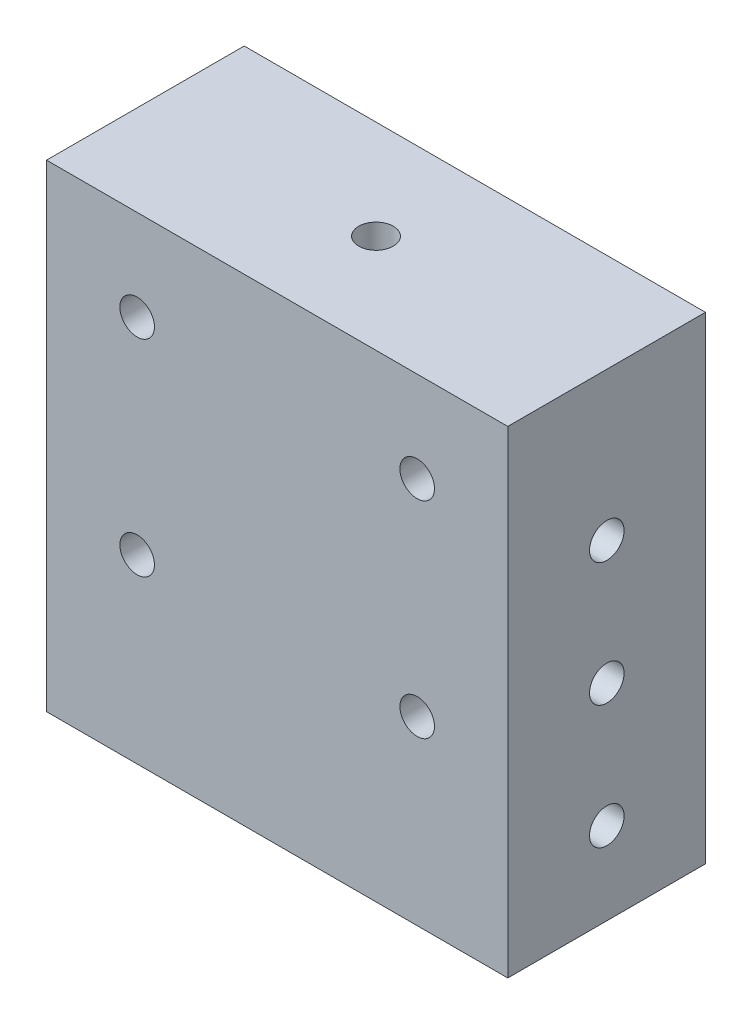
ISO-10303-21;
HEADER;
FILE_DESCRIPTION(('STEP AP214'),'2;1');
FILE_NAME('part.step','',(''),(''),'','','');
FILE_SCHEMA(('AUTOMOTIVE_DESIGN { 1 0 10303 214 1 1 1 1 }'));
ENDSEC;
DATA;
#1=APPLICATION_CONTEXT('core data for automotive mechanical design processes');
#2=APPLICATION_PROTOCOL_DEFINITION('international standard','automotive_design',2000,#1);
#3=PRODUCT_CONTEXT('',#1,'mechanical');
#4=PRODUCT('Part','Part','',(#3));
#5=PRODUCT_RELATED_PRODUCT_CATEGORY('part','',(#4));
#6=PRODUCT_DEFINITION_FORMATION('','',#4);
#7=PRODUCT_DEFINITION_CONTEXT('part definition',#1,'design');
#8=PRODUCT_DEFINITION('design','',#6,#7);
#9=PRODUCT_DEFINITION_SHAPE('','',#8);
#10=(LENGTH_UNIT() NAMED_UNIT(*) SI_UNIT(.MILLI.,.METRE.));
#11=(NAMED_UNIT(*) PLANE_ANGLE_UNIT() SI_UNIT($,.RADIAN.));
#12=(NAMED_UNIT(*) SI_UNIT($,.STERADIAN.) SOLID_ANGLE_UNIT());
#13=UNCERTAINTY_MEASURE_WITH_UNIT(LENGTH_MEASURE(1.E-05),#10,'distance_accuracy_value','');
#14=(GEOMETRIC_REPRESENTATION_CONTEXT(3) GLOBAL_UNCERTAINTY_ASSIGNED_CONTEXT((#13)) GLOBAL_UNIT_ASSIGNED_CONTEXT((#10,
#11,#12)) REPRESENTATION_CONTEXT('',''));
#15=CARTESIAN_POINT('',(0.,0.,0.));
#16=DIRECTION('',(0.,0.,1.));
#17=DIRECTION('',(1.,0.,0.));
#18=AXIS2_PLACEMENT_3D('',#15,#16,#17);
#19=CARTESIAN_POINT('',(0.,0.,4.));
#20=DIRECTION('',(0.,0.,1.));
#21=DIRECTION('',(1.,0.,0.));
#22=AXIS2_PLACEMENT_3D('',#19,#20,#21);
#23=PLANE('',#22);
#24=CARTESIAN_POINT('',(17.,22.,4.));
#25=DIRECTION('',(0.,0.,-1.));
#26=DIRECTION('',(-1.,0.,0.));
#27=AXIS2_PLACEMENT_3D('',#24,#25,#26);
#28=CIRCLE('',#27,2.1);
#29=CARTESIAN_POINT('',(14.9,22.,4.));
#30=VERTEX_POINT('',#29);
#31=EDGE_CURVE('E376',#30,#30,#28,.T.);
#32=ORIENTED_EDGE('',*,*,#31,.T.);
#33=EDGE_LOOP('',(#32));
#34=FACE_BOUND('',#33,.T.);
#35=DIRECTION('',(-1.,0.,0.));
#36=VECTOR('',#35,1.);
#37=CARTESIAN_POINT('',(28.,33.,4.));
#38=LINE('',#37,#36);
#39=CARTESIAN_POINT('',(28.,33.,4.));
#40=VERTEX_POINT('',#39);
#41=CARTESIAN_POINT('',(-28.,33.,4.));
#42=VERTEX_POINT('',#41);
#43=EDGE_CURVE('E180',#40,#42,#38,.T.);
#44=ORIENTED_EDGE('',*,*,#43,.T.);
#45=DIRECTION('',(0.,1.,0.));
#46=VECTOR('',#45,1.);
#47=CARTESIAN_POINT('',(-28.,-25.,4.));
#48=LINE('',#47,#46);
#49=CARTESIAN_POINT('',(-28.,-25.,4.));
#50=VERTEX_POINT('',#49);
#51=EDGE_CURVE('E231',#50,#42,#48,.T.);
#52=ORIENTED_EDGE('',*,*,#51,.F.);
#53=DIRECTION('',(1.,0.,0.));
#54=VECTOR('',#53,1.);
#55=CARTESIAN_POINT('',(20.,-25.,4.));
#56=LINE('',#55,#54);
#57=CARTESIAN_POINT('',(28.,-25.,4.));
#58=VERTEX_POINT('',#57);
#59=EDGE_CURVE('E184',#50,#58,#56,.T.);
#60=ORIENTED_EDGE('',*,*,#59,.T.);
#61=DIRECTION('',(0.,-1.,0.));
#62=VECTOR('',#61,1.);
#63=CARTESIAN_POINT('',(28.,-25.,4.));
#64=LINE('',#63,#62);
#65=EDGE_CURVE('E257',#40,#58,#64,.T.);
#66=ORIENTED_EDGE('',*,*,#65,.F.);
#67=EDGE_LOOP('',(#44,#52,#60,#66));
#68=FACE_BOUND('',#67,.T.);
#69=CARTESIAN_POINT('',(17.,-3.,4.));
#70=DIRECTION('',(0.,0.,-1.));
#71=DIRECTION('',(-1.,0.,0.));
#72=AXIS2_PLACEMENT_3D('',#69,#70,#71);
#73=CIRCLE('',#72,2.1);
#74=CARTESIAN_POINT('',(14.9,-3.,4.));
#75=VERTEX_POINT('',#74);
#76=EDGE_CURVE('E166',#75,#75,#73,.T.);
#77=ORIENTED_EDGE('',*,*,#76,.T.);
#78=EDGE_LOOP('',(#77));
#79=FACE_BOUND('',#78,.T.);
#80=CARTESIAN_POINT('',(-17.,-3.,4.));
#81=DIRECTION('',(0.,0.,-1.));
#82=DIRECTION('',(-1.,0.,0.));
#83=AXIS2_PLACEMENT_3D('',#80,#81,#82);
#84=CIRCLE('',#83,2.1);
#85=CARTESIAN_POINT('',(-19.1,-3.,4.));
#86=VERTEX_POINT('',#85);
#87=EDGE_CURVE('E404',#86,#86,#84,.T.);
#88=ORIENTED_EDGE('',*,*,#87,.T.);
#89=EDGE_LOOP('',(#88));
#90=FACE_BOUND('',#89,.T.);
#91=CARTESIAN_POINT('',(-17.,22.,4.));
#92=DIRECTION('',(0.,0.,-1.));
#93=DIRECTION('',(-1.,0.,0.));
#94=AXIS2_PLACEMENT_3D('',#91,#92,#93);
#95=CIRCLE('',#94,2.1);
#96=CARTESIAN_POINT('',(-19.1,22.,4.));
#97=VERTEX_POINT('',#96);
#98=EDGE_CURVE('E396',#97,#97,#95,.T.);
#99=ORIENTED_EDGE('',*,*,#98,.T.);
#100=EDGE_LOOP('',(#99));
#101=FACE_BOUND('',#100,.T.);
#102=ADVANCED_FACE('F56',(#34,#68,#79,#90,#101),#23,.T.);
#103=CARTESIAN_POINT('',(0.,0.,-4.));
#104=DIRECTION('',(0.,0.,1.));
#105=DIRECTION('',(1.,0.,0.));
#106=AXIS2_PLACEMENT_3D('',#103,#104,#105);
#107=PLANE('',#106);
#108=CARTESIAN_POINT('',(17.,22.,-4.));
#109=DIRECTION('',(0.,0.,-1.));
#110=DIRECTION('',(-1.,0.,0.));
#111=AXIS2_PLACEMENT_3D('',#108,#109,#110);
#112=CIRCLE('',#111,2.1);
#113=CARTESIAN_POINT('',(14.9,22.,-4.));
#114=VERTEX_POINT('',#113);
#115=EDGE_CURVE('E370',#114,#114,#112,.T.);
#116=ORIENTED_EDGE('',*,*,#115,.F.);
#117=EDGE_LOOP('',(#116));
#118=FACE_BOUND('',#117,.T.);
#119=CARTESIAN_POINT('',(-17.,22.,-4.));
#120=DIRECTION('',(0.,0.,-1.));
#121=DIRECTION('',(-1.,0.,0.));
#122=AXIS2_PLACEMENT_3D('',#119,#120,#121);
#123=CIRCLE('',#122,2.1);
#124=CARTESIAN_POINT('',(-19.1,22.,-4.));
#125=VERTEX_POINT('',#124);
#126=EDGE_CURVE('E392',#125,#125,#123,.T.);
#127=ORIENTED_EDGE('',*,*,#126,.F.);
#128=EDGE_LOOP('',(#127));
#129=FACE_BOUND('',#128,.T.);
#130=CARTESIAN_POINT('',(-17.,-3.,-4.));
#131=DIRECTION('',(0.,0.,-1.));
#132=DIRECTION('',(-1.,0.,0.));
#133=AXIS2_PLACEMENT_3D('',#130,#131,#132);
#134=CIRCLE('',#133,2.1);
#135=CARTESIAN_POINT('',(-19.1,-3.,-4.));
#136=VERTEX_POINT('',#135);
#137=EDGE_CURVE('E400',#136,#136,#134,.T.);
#138=ORIENTED_EDGE('',*,*,#137,.F.);
#139=EDGE_LOOP('',(#138));
#140=FACE_BOUND('',#139,.T.);
#141=DIRECTION('',(0.,-1.,0.));
#142=VECTOR('',#141,1.);
#143=CARTESIAN_POINT('',(-20.,-25.,-4.));
#144=LINE('',#143,#142);
#145=CARTESIAN_POINT('',(-20.,25.,-4.));
#146=VERTEX_POINT('',#145);
#147=CARTESIAN_POINT('',(-20.,-25.,-4.));
#148=VERTEX_POINT('',#147);
#149=EDGE_CURVE('E179',#146,#148,#144,.T.);
#150=ORIENTED_EDGE('',*,*,#149,.F.);
#151=DIRECTION('',(-1.,0.,0.));
#152=VECTOR('',#151,1.);
#153=CARTESIAN_POINT('',(20.,25.,-4.));
#154=LINE('',#153,#152);
#155=CARTESIAN_POINT('',(20.,25.,-4.));
#156=VERTEX_POINT('',#155);
#157=EDGE_CURVE('E187',#156,#146,#154,.T.);
#158=ORIENTED_EDGE('',*,*,#157,.F.);
#159=DIRECTION('',(0.,1.,0.));
#160=VECTOR('',#159,1.);
#161=CARTESIAN_POINT('',(20.,-25.,-4.));
#162=LINE('',#161,#160);
#163=CARTESIAN_POINT('',(20.,-25.,-4.));
#164=VERTEX_POINT('',#163);
#165=EDGE_CURVE('E194',#164,#156,#162,.T.);
#166=ORIENTED_EDGE('',*,*,#165,.F.);
#167=DIRECTION('',(1.,0.,0.));
#168=VECTOR('',#167,1.);
#169=CARTESIAN_POINT('',(20.,-25.,-4.));
#170=LINE('',#169,#168);
#171=EDGE_CURVE('E191',#148,#164,#170,.T.);
#172=ORIENTED_EDGE('',*,*,#171,.F.);
#173=EDGE_LOOP('',(#150,#158,#166,#172));
#174=FACE_BOUND('',#173,.T.);
#175=CARTESIAN_POINT('',(17.,-3.,-4.));
#176=DIRECTION('',(0.,0.,-1.));
#177=DIRECTION('',(-1.,0.,0.));
#178=AXIS2_PLACEMENT_3D('',#175,#176,#177);
#179=CIRCLE('',#178,2.1);
#180=CARTESIAN_POINT('',(14.9,-3.,-4.));
#181=VERTEX_POINT('',#180);
#182=EDGE_CURVE('E408',#181,#181,#179,.T.);
#183=ORIENTED_EDGE('',*,*,#182,.F.);
#184=EDGE_LOOP('',(#183));
#185=FACE_BOUND('',#184,.T.);
#186=ADVANCED_FACE('F308',(#118,#129,#140,#174,#185),#107,.F.);
#187=CARTESIAN_POINT('',(-82.7694193059008,0.,-12.05));
#188=DIRECTION('',(0.,0.,-1.));
#189=DIRECTION('',(0.,1.,0.));
#190=AXIS2_PLACEMENT_3D('',#187,#188,#189);
#191=PLANE('',#190);
#192=DIRECTION('',(1.,0.,0.));
#193=VECTOR('',#192,1.);
#194=CARTESIAN_POINT('',(-82.7694193059008,25.,-12.05));
#195=LINE('',#194,#193);
#196=CARTESIAN_POINT('',(16.,25.,-12.05));
#197=VERTEX_POINT('',#196);
#198=CARTESIAN_POINT('',(20.,25.,-12.05));
#199=VERTEX_POINT('',#198);
#200=EDGE_CURVE('E217',#197,#199,#195,.T.);
#201=ORIENTED_EDGE('',*,*,#200,.F.);
#202=DIRECTION('',(0.,-1.,0.));
#203=VECTOR('',#202,1.);
#204=CARTESIAN_POINT('',(16.,0.,-12.05));
#205=LINE('',#204,#203);
#206=CARTESIAN_POINT('',(16.,-25.,-12.05));
#207=VERTEX_POINT('',#206);
#208=EDGE_CURVE('E13',#197,#207,#205,.T.);
#209=ORIENTED_EDGE('',*,*,#208,.T.);
#210=DIRECTION('',(1.,0.,0.));
#211=VECTOR('',#210,1.);
#212=CARTESIAN_POINT('',(-82.7694193059008,-25.,-12.05));
#213=LINE('',#212,#211);
#214=CARTESIAN_POINT('',(20.,-25.,-12.05));
#215=VERTEX_POINT('',#214);
#216=EDGE_CURVE('E230',#207,#215,#213,.T.);
#217=ORIENTED_EDGE('',*,*,#216,.T.);
#218=DIRECTION('',(0.,1.,0.));
#219=VECTOR('',#218,1.);
#220=CARTESIAN_POINT('',(20.,0.,-12.05));
#221=LINE('',#220,#219);
#222=EDGE_CURVE('E224',#215,#199,#221,.T.);
#223=ORIENTED_EDGE('',*,*,#222,.T.);
#224=EDGE_LOOP('',(#201,#209,#217,#223));
#225=FACE_BOUND('',#224,.T.);
#226=ADVANCED_FACE('F317',(#225),#191,.F.);
#227=CARTESIAN_POINT('',(20.,0.,0.));
#228=DIRECTION('',(-1.,0.,0.));
#229=DIRECTION('',(0.,0.,1.));
#230=AXIS2_PLACEMENT_3D('',#227,#228,#229);
#231=PLANE('',#230);
#232=CARTESIAN_POINT('',(20.,15.,-8.025));
#233=DIRECTION('',(-1.,0.,0.));
#234=DIRECTION('',(0.,0.,1.));
#235=AXIS2_PLACEMENT_3D('',#232,#233,#234);
#236=CIRCLE('',#235,2.09999999999999);
#237=CARTESIAN_POINT('',(20.,15.,-5.92500000000001));
#238=VERTEX_POINT('',#237);
#239=EDGE_CURVE('E458',#238,#238,#236,.T.);
#240=ORIENTED_EDGE('',*,*,#239,.F.);
#241=EDGE_LOOP('',(#240));
#242=FACE_BOUND('',#241,.T.);
#243=CARTESIAN_POINT('',(20.,0.,-8.02500000000001));
#244=DIRECTION('',(-1.,0.,0.));
#245=DIRECTION('',(0.,0.,1.));
#246=AXIS2_PLACEMENT_3D('',#243,#244,#245);
#247=CIRCLE('',#246,2.09999999999999);
#248=CARTESIAN_POINT('',(20.,0.,-5.92500000000001));
#249=VERTEX_POINT('',#248);
#250=EDGE_CURVE('E466',#249,#249,#247,.T.);
#251=ORIENTED_EDGE('',*,*,#250,.F.);
#252=EDGE_LOOP('',(#251));
#253=FACE_BOUND('',#252,.T.);
#254=CARTESIAN_POINT('',(20.,-15.,-8.025));
#255=DIRECTION('',(-1.,0.,0.));
#256=DIRECTION('',(0.,0.,1.));
#257=AXIS2_PLACEMENT_3D('',#254,#255,#256);
#258=CIRCLE('',#257,2.09999999999999);
#259=CARTESIAN_POINT('',(20.,-15.,-5.92500000000001));
#260=VERTEX_POINT('',#259);
#261=EDGE_CURVE('E379',#260,#260,#258,.T.);
#262=ORIENTED_EDGE('',*,*,#261,.F.);
#263=EDGE_LOOP('',(#262));
#264=FACE_BOUND('',#263,.T.);
#265=DIRECTION('',(0.,0.,1.));
#266=VECTOR('',#265,1.);
#267=CARTESIAN_POINT('',(20.,25.,0.));
#268=LINE('',#267,#266);
#269=EDGE_CURVE('E216',#199,#156,#268,.T.);
#270=ORIENTED_EDGE('',*,*,#269,.F.);
#271=ORIENTED_EDGE('',*,*,#222,.F.);
#272=DIRECTION('',(0.,0.,-1.));
#273=VECTOR('',#272,1.);
#274=CARTESIAN_POINT('',(20.,-25.,-20.));
#275=LINE('',#274,#273);
#276=EDGE_CURVE('E244',#164,#215,#275,.T.);
#277=ORIENTED_EDGE('',*,*,#276,.F.);
#278=ORIENTED_EDGE('',*,*,#165,.T.);
#279=EDGE_LOOP('',(#270,#271,#277,#278));
#280=FACE_BOUND('',#279,.T.);
#281=ADVANCED_FACE('F314',(#242,#253,#264,#280),#231,.T.);
#282=CARTESIAN_POINT('',(-20.,0.,0.));
#283=DIRECTION('',(-1.,0.,0.));
#284=DIRECTION('',(0.,0.,1.));
#285=AXIS2_PLACEMENT_3D('',#282,#283,#284);
#286=PLANE('',#285);
#287=DIRECTION('',(0.,1.,0.));
#288=VECTOR('',#287,1.);
#289=CARTESIAN_POINT('',(-20.,0.,-12.05));
#290=LINE('',#289,#288);
#291=CARTESIAN_POINT('',(-20.,-25.,-12.05));
#292=VERTEX_POINT('',#291);
#293=CARTESIAN_POINT('',(-20.,25.,-12.05));
#294=VERTEX_POINT('',#293);
#295=EDGE_CURVE('E222',#292,#294,#290,.T.);
#296=ORIENTED_EDGE('',*,*,#295,.T.);
#297=DIRECTION('',(0.,0.,1.));
#298=VECTOR('',#297,1.);
#299=CARTESIAN_POINT('',(-20.,25.,0.));
#300=LINE('',#299,#298);
#301=EDGE_CURVE('E214',#294,#146,#300,.T.);
#302=ORIENTED_EDGE('',*,*,#301,.T.);
#303=ORIENTED_EDGE('',*,*,#149,.T.);
#304=DIRECTION('',(0.,0.,1.));
#305=VECTOR('',#304,1.);
#306=CARTESIAN_POINT('',(-20.,-25.,4.));
#307=LINE('',#306,#305);
#308=EDGE_CURVE('E81',#292,#148,#307,.T.);
#309=ORIENTED_EDGE('',*,*,#308,.F.);
#310=EDGE_LOOP('',(#296,#302,#303,#309));
#311=FACE_BOUND('',#310,.T.);
#312=ADVANCED_FACE('F305',(#311),#286,.F.);
#313=CARTESIAN_POINT('',(20.,-25.,4.));
#314=DIRECTION('',(0.,1.,0.));
#315=DIRECTION('',(-1.,0.,0.));
#316=AXIS2_PLACEMENT_3D('',#313,#314,#315);
#317=PLANE('',#316);
#318=ORIENTED_EDGE('',*,*,#216,.F.);
#319=DIRECTION('',(0.,0.,-1.));
#320=VECTOR('',#319,1.);
#321=CARTESIAN_POINT('',(16.,-25.,-12.));
#322=LINE('',#321,#320);
#323=CARTESIAN_POINT('',(16.,-25.,-20.));
#324=VERTEX_POINT('',#323);
#325=EDGE_CURVE('E282',#207,#324,#322,.T.);
#326=ORIENTED_EDGE('',*,*,#325,.T.);
#327=DIRECTION('',(-1.,0.,0.));
#328=VECTOR('',#327,1.);
#329=CARTESIAN_POINT('',(28.,-25.,-20.));
#330=LINE('',#329,#328);
#331=CARTESIAN_POINT('',(28.,-25.,-20.));
#332=VERTEX_POINT('',#331);
#333=EDGE_CURVE('E173',#332,#324,#330,.T.);
#334=ORIENTED_EDGE('',*,*,#333,.F.);
#335=DIRECTION('',(0.,0.,-1.));
#336=VECTOR('',#335,1.);
#337=CARTESIAN_POINT('',(28.,-25.,-20.));
#338=LINE('',#337,#336);
#339=EDGE_CURVE('E247',#58,#332,#338,.T.);
#340=ORIENTED_EDGE('',*,*,#339,.F.);
#341=ORIENTED_EDGE('',*,*,#59,.F.);
#342=DIRECTION('',(0.,0.,1.));
#343=VECTOR('',#342,1.);
#344=CARTESIAN_POINT('',(-28.,-25.,4.));
#345=LINE('',#344,#343);
#346=CARTESIAN_POINT('',(-28.,-25.,-20.));
#347=VERTEX_POINT('',#346);
#348=EDGE_CURVE('E171',#347,#50,#345,.T.);
#349=ORIENTED_EDGE('',*,*,#348,.F.);
#350=CARTESIAN_POINT('',(-16.,-25.,-20.));
#351=VERTEX_POINT('',#350);
#352=EDGE_CURVE('E160',#351,#347,#330,.T.);
#353=ORIENTED_EDGE('',*,*,#352,.F.);
#354=DIRECTION('',(0.,0.,-1.));
#355=VECTOR('',#354,1.);
#356=CARTESIAN_POINT('',(-16.,-25.,-12.));
#357=LINE('',#356,#355);
#358=CARTESIAN_POINT('',(-16.,-25.,-12.05));
#359=VERTEX_POINT('',#358);
#360=EDGE_CURVE('E146',#359,#351,#357,.T.);
#361=ORIENTED_EDGE('',*,*,#360,.F.);
#362=EDGE_CURVE('E209',#292,#359,#213,.T.);
#363=ORIENTED_EDGE('',*,*,#362,.F.);
#364=ORIENTED_EDGE('',*,*,#308,.T.);
#365=ORIENTED_EDGE('',*,*,#171,.T.);
#366=ORIENTED_EDGE('',*,*,#276,.T.);
#367=EDGE_LOOP('',(#318,#326,#334,#340,#341,#349,#353,#361,#363,#364,#365,#366));
#368=FACE_BOUND('',#367,.T.);
#369=ADVANCED_FACE('F58',(#368),#317,.F.);
#370=CARTESIAN_POINT('',(28.,33.,-20.));
#371=DIRECTION('',(0.,0.,1.));
#372=DIRECTION('',(0.,-1.,0.));
#373=AXIS2_PLACEMENT_3D('',#370,#371,#372);
#374=PLANE('',#373);
#375=ORIENTED_EDGE('',*,*,#333,.T.);
#376=DIRECTION('',(0.,-1.,0.));
#377=VECTOR('',#376,1.);
#378=CARTESIAN_POINT('',(16.,-25.,-20.));
#379=LINE('',#378,#377);
#380=CARTESIAN_POINT('',(16.,25.,-20.));
#381=VERTEX_POINT('',#380);
#382=EDGE_CURVE('E154',#381,#324,#379,.T.);
#383=ORIENTED_EDGE('',*,*,#382,.F.);
#384=DIRECTION('',(1.,0.,0.));
#385=VECTOR('',#384,1.);
#386=CARTESIAN_POINT('',(16.,25.,-20.));
#387=LINE('',#386,#385);
#388=CARTESIAN_POINT('',(-16.,25.,-20.));
#389=VERTEX_POINT('',#388);
#390=EDGE_CURVE('E164',#389,#381,#387,.T.);
#391=ORIENTED_EDGE('',*,*,#390,.F.);
#392=DIRECTION('',(0.,1.,0.));
#393=VECTOR('',#392,1.);
#394=CARTESIAN_POINT('',(-16.,25.,-20.));
#395=LINE('',#394,#393);
#396=EDGE_CURVE('E149',#351,#389,#395,.T.);
#397=ORIENTED_EDGE('',*,*,#396,.F.);
#398=ORIENTED_EDGE('',*,*,#352,.T.);
#399=DIRECTION('',(0.,-1.,0.));
#400=VECTOR('',#399,1.);
#401=CARTESIAN_POINT('',(-28.,-25.,-20.));
#402=LINE('',#401,#400);
#403=CARTESIAN_POINT('',(-28.,33.,-20.));
#404=VERTEX_POINT('',#403);
#405=EDGE_CURVE('E239',#404,#347,#402,.T.);
#406=ORIENTED_EDGE('',*,*,#405,.F.);
#407=DIRECTION('',(-1.,0.,0.));
#408=VECTOR('',#407,1.);
#409=CARTESIAN_POINT('',(28.,33.,-20.));
#410=LINE('',#409,#408);
#411=CARTESIAN_POINT('',(28.,33.,-20.));
#412=VERTEX_POINT('',#411);
#413=EDGE_CURVE('E174',#412,#404,#410,.T.);
#414=ORIENTED_EDGE('',*,*,#413,.F.);
#415=DIRECTION('',(0.,1.,0.));
#416=VECTOR('',#415,1.);
#417=CARTESIAN_POINT('',(28.,33.,-20.));
#418=LINE('',#417,#416);
#419=EDGE_CURVE('E251',#332,#412,#418,.T.);
#420=ORIENTED_EDGE('',*,*,#419,.F.);
#421=EDGE_LOOP('',(#375,#383,#391,#397,#398,#406,#414,#420));
#422=FACE_BOUND('',#421,.T.);
#423=ADVANCED_FACE('F158',(#422),#374,.F.);
#424=CARTESIAN_POINT('',(28.,33.,4.));
#425=DIRECTION('',(0.,-1.,0.));
#426=DIRECTION('',(0.,0.,-1.));
#427=AXIS2_PLACEMENT_3D('',#424,#425,#426);
#428=PLANE('',#427);
#429=CARTESIAN_POINT('',(0.,33.,-8.));
#430=DIRECTION('',(0.,1.,0.));
#431=DIRECTION('',(0.,0.,1.));
#432=AXIS2_PLACEMENT_3D('',#429,#430,#431);
#433=CIRCLE('',#432,2.09999999999999);
#434=CARTESIAN_POINT('',(0.,33.,-5.90000000000001));
#435=VERTEX_POINT('',#434);
#436=EDGE_CURVE('E371',#435,#435,#433,.T.);
#437=ORIENTED_EDGE('',*,*,#436,.F.);
#438=EDGE_LOOP('',(#437));
#439=FACE_BOUND('',#438,.T.);
#440=ORIENTED_EDGE('',*,*,#413,.T.);
#441=DIRECTION('',(0.,0.,-1.));
#442=VECTOR('',#441,1.);
#443=CARTESIAN_POINT('',(-28.,33.,4.));
#444=LINE('',#443,#442);
#445=EDGE_CURVE('E235',#42,#404,#444,.T.);
#446=ORIENTED_EDGE('',*,*,#445,.F.);
#447=ORIENTED_EDGE('',*,*,#43,.F.);
#448=DIRECTION('',(0.,0.,1.));
#449=VECTOR('',#448,1.);
#450=CARTESIAN_POINT('',(28.,33.,4.));
#451=LINE('',#450,#449);
#452=EDGE_CURVE('E254',#412,#40,#451,.T.);
#453=ORIENTED_EDGE('',*,*,#452,.F.);
#454=EDGE_LOOP('',(#440,#446,#447,#453));
#455=FACE_BOUND('',#454,.T.);
#456=ADVANCED_FACE('F273',(#439,#455),#428,.F.);
#457=CARTESIAN_POINT('',(28.,0.,0.));
#458=DIRECTION('',(-1.,0.,0.));
#459=DIRECTION('',(0.,0.,1.));
#460=AXIS2_PLACEMENT_3D('',#457,#458,#459);
#461=PLANE('',#460);
#462=CARTESIAN_POINT('',(28.,15.,-8.025));
#463=DIRECTION('',(1.,0.,0.));
#464=DIRECTION('',(0.,0.,-1.));
#465=AXIS2_PLACEMENT_3D('',#462,#463,#464);
#466=CIRCLE('',#465,2.09999999999999);
#467=CARTESIAN_POINT('',(28.,15.,-10.125));
#468=VERTEX_POINT('',#467);
#469=EDGE_CURVE('E455',#468,#468,#466,.T.);
#470=ORIENTED_EDGE('',*,*,#469,.F.);
#471=EDGE_LOOP('',(#470));
#472=FACE_BOUND('',#471,.T.);
#473=CARTESIAN_POINT('',(28.,0.,-8.02500000000001));
#474=DIRECTION('',(1.,0.,0.));
#475=DIRECTION('',(0.,0.,-1.));
#476=AXIS2_PLACEMENT_3D('',#473,#474,#475);
#477=CIRCLE('',#476,2.09999999999999);
#478=CARTESIAN_POINT('',(28.,0.,-10.125));
#479=VERTEX_POINT('',#478);
#480=EDGE_CURVE('E460',#479,#479,#477,.T.);
#481=ORIENTED_EDGE('',*,*,#480,.F.);
#482=EDGE_LOOP('',(#481));
#483=FACE_BOUND('',#482,.T.);
#484=CARTESIAN_POINT('',(28.,-15.,-8.025));
#485=DIRECTION('',(1.,0.,0.));
#486=DIRECTION('',(0.,0.,-1.));
#487=AXIS2_PLACEMENT_3D('',#484,#485,#486);
#488=CIRCLE('',#487,2.09999999999999);
#489=CARTESIAN_POINT('',(28.,-15.,-10.125));
#490=VERTEX_POINT('',#489);
#491=EDGE_CURVE('E386',#490,#490,#488,.T.);
#492=ORIENTED_EDGE('',*,*,#491,.F.);
#493=EDGE_LOOP('',(#492));
#494=FACE_BOUND('',#493,.T.);
#495=ORIENTED_EDGE('',*,*,#339,.T.);
#496=ORIENTED_EDGE('',*,*,#419,.T.);
#497=ORIENTED_EDGE('',*,*,#452,.T.);
#498=ORIENTED_EDGE('',*,*,#65,.T.);
#499=EDGE_LOOP('',(#495,#496,#497,#498));
#500=FACE_BOUND('',#499,.T.);
#501=ADVANCED_FACE('F278',(#472,#483,#494,#500),#461,.F.);
#502=CARTESIAN_POINT('',(-28.,0.,0.));
#503=DIRECTION('',(-1.,0.,0.));
#504=DIRECTION('',(0.,0.,1.));
#505=AXIS2_PLACEMENT_3D('',#502,#503,#504);
#506=PLANE('',#505);
#507=ORIENTED_EDGE('',*,*,#51,.T.);
#508=ORIENTED_EDGE('',*,*,#445,.T.);
#509=ORIENTED_EDGE('',*,*,#405,.T.);
#510=ORIENTED_EDGE('',*,*,#348,.T.);
#511=EDGE_LOOP('',(#507,#508,#509,#510));
#512=FACE_BOUND('',#511,.T.);
#513=ADVANCED_FACE('F276',(#512),#506,.T.);
#514=CARTESIAN_POINT('',(-82.7694193059008,25.,0.));
#515=DIRECTION('',(0.,1.,0.));
#516=DIRECTION('',(0.,0.,1.));
#517=AXIS2_PLACEMENT_3D('',#514,#515,#516);
#518=PLANE('',#517);
#519=CARTESIAN_POINT('',(0.,25.,-8.));
#520=DIRECTION('',(0.,1.,0.));
#521=DIRECTION('',(0.,0.,1.));
#522=AXIS2_PLACEMENT_3D('',#519,#520,#521);
#523=CIRCLE('',#522,2.09999999999999);
#524=CARTESIAN_POINT('',(0.,25.,-5.90000000000001));
#525=VERTEX_POINT('',#524);
#526=EDGE_CURVE('E60',#525,#525,#523,.T.);
#527=ORIENTED_EDGE('',*,*,#526,.T.);
#528=EDGE_LOOP('',(#527));
#529=FACE_BOUND('',#528,.T.);
#530=DIRECTION('',(0.,0.,-1.));
#531=VECTOR('',#530,1.);
#532=CARTESIAN_POINT('',(16.,25.,-12.));
#533=LINE('',#532,#531);
#534=EDGE_CURVE('E292',#197,#381,#533,.T.);
#535=ORIENTED_EDGE('',*,*,#534,.F.);
#536=ORIENTED_EDGE('',*,*,#200,.T.);
#537=ORIENTED_EDGE('',*,*,#269,.T.);
#538=ORIENTED_EDGE('',*,*,#157,.T.);
#539=ORIENTED_EDGE('',*,*,#301,.F.);
#540=CARTESIAN_POINT('',(-16.,25.,-12.05));
#541=VERTEX_POINT('',#540);
#542=EDGE_CURVE('E207',#294,#541,#195,.T.);
#543=ORIENTED_EDGE('',*,*,#542,.T.);
#544=DIRECTION('',(0.,0.,-1.));
#545=VECTOR('',#544,1.);
#546=CARTESIAN_POINT('',(-16.,25.,-12.));
#547=LINE('',#546,#545);
#548=EDGE_CURVE('E73',#541,#389,#547,.T.);
#549=ORIENTED_EDGE('',*,*,#548,.T.);
#550=ORIENTED_EDGE('',*,*,#390,.T.);
#551=EDGE_LOOP('',(#535,#536,#537,#538,#539,#543,#549,#550));
#552=FACE_BOUND('',#551,.T.);
#553=ADVANCED_FACE('F212',(#529,#552),#518,.F.);
#554=ORIENTED_EDGE('',*,*,#362,.T.);
#555=DIRECTION('',(0.,1.,0.));
#556=VECTOR('',#555,1.);
#557=CARTESIAN_POINT('',(-16.,0.,-12.05));
#558=LINE('',#557,#556);
#559=EDGE_CURVE('E66',#359,#541,#558,.T.);
#560=ORIENTED_EDGE('',*,*,#559,.T.);
#561=ORIENTED_EDGE('',*,*,#542,.F.);
#562=ORIENTED_EDGE('',*,*,#295,.F.);
#563=EDGE_LOOP('',(#554,#560,#561,#562));
#564=FACE_BOUND('',#563,.T.);
#565=ADVANCED_FACE('F205',(#564),#191,.F.);
#566=CARTESIAN_POINT('',(16.,-25.,-12.));
#567=DIRECTION('',(1.,0.,0.));
#568=DIRECTION('',(0.,0.,-1.));
#569=AXIS2_PLACEMENT_3D('',#566,#567,#568);
#570=PLANE('',#569);
#571=ORIENTED_EDGE('',*,*,#534,.T.);
#572=ORIENTED_EDGE('',*,*,#382,.T.);
#573=ORIENTED_EDGE('',*,*,#325,.F.);
#574=ORIENTED_EDGE('',*,*,#208,.F.);
#575=EDGE_LOOP('',(#571,#572,#573,#574));
#576=FACE_BOUND('',#575,.T.);
#577=ADVANCED_FACE('F327',(#576),#570,.F.);
#578=CARTESIAN_POINT('',(-16.,25.,-12.));
#579=DIRECTION('',(-1.,0.,0.));
#580=DIRECTION('',(0.,-1.,0.));
#581=AXIS2_PLACEMENT_3D('',#578,#579,#580);
#582=PLANE('',#581);
#583=ORIENTED_EDGE('',*,*,#360,.T.);
#584=ORIENTED_EDGE('',*,*,#396,.T.);
#585=ORIENTED_EDGE('',*,*,#548,.F.);
#586=ORIENTED_EDGE('',*,*,#559,.F.);
#587=EDGE_LOOP('',(#583,#584,#585,#586));
#588=FACE_BOUND('',#587,.T.);
#589=ADVANCED_FACE('F148',(#588),#582,.F.);
#590=CARTESIAN_POINT('',(17.,-3.,-4.));
#591=DIRECTION('',(0.,0.,-1.));
#592=DIRECTION('',(-1.,0.,0.));
#593=AXIS2_PLACEMENT_3D('',#590,#591,#592);
#594=CYLINDRICAL_SURFACE('',#593,2.1);
#595=ORIENTED_EDGE('',*,*,#76,.F.);
#596=EDGE_LOOP('',(#595));
#597=FACE_BOUND('',#596,.T.);
#598=ORIENTED_EDGE('',*,*,#182,.T.);
#599=EDGE_LOOP('',(#598));
#600=FACE_BOUND('',#599,.T.);
#601=ADVANCED_FACE('F334',(#597,#600),#594,.F.);
#602=CARTESIAN_POINT('',(-17.,-3.,-4.));
#603=DIRECTION('',(0.,0.,-1.));
#604=DIRECTION('',(-1.,0.,0.));
#605=AXIS2_PLACEMENT_3D('',#602,#603,#604);
#606=CYLINDRICAL_SURFACE('',#605,2.1);
#607=ORIENTED_EDGE('',*,*,#87,.F.);
#608=EDGE_LOOP('',(#607));
#609=FACE_BOUND('',#608,.T.);
#610=ORIENTED_EDGE('',*,*,#137,.T.);
#611=EDGE_LOOP('',(#610));
#612=FACE_BOUND('',#611,.T.);
#613=ADVANCED_FACE('F420',(#609,#612),#606,.F.);
#614=CARTESIAN_POINT('',(-17.,22.,-4.));
#615=DIRECTION('',(0.,0.,-1.));
#616=DIRECTION('',(-1.,0.,0.));
#617=AXIS2_PLACEMENT_3D('',#614,#615,#616);
#618=CYLINDRICAL_SURFACE('',#617,2.1);
#619=ORIENTED_EDGE('',*,*,#98,.F.);
#620=EDGE_LOOP('',(#619));
#621=FACE_BOUND('',#620,.T.);
#622=ORIENTED_EDGE('',*,*,#126,.T.);
#623=EDGE_LOOP('',(#622));
#624=FACE_BOUND('',#623,.T.);
#625=ADVANCED_FACE('F425',(#621,#624),#618,.F.);
#626=CARTESIAN_POINT('',(17.,22.,-4.));
#627=DIRECTION('',(0.,0.,-1.));
#628=DIRECTION('',(-1.,0.,0.));
#629=AXIS2_PLACEMENT_3D('',#626,#627,#628);
#630=CYLINDRICAL_SURFACE('',#629,2.1);
#631=ORIENTED_EDGE('',*,*,#31,.F.);
#632=EDGE_LOOP('',(#631));
#633=FACE_BOUND('',#632,.T.);
#634=ORIENTED_EDGE('',*,*,#115,.T.);
#635=EDGE_LOOP('',(#634));
#636=FACE_BOUND('',#635,.T.);
#637=ADVANCED_FACE('F431',(#633,#636),#630,.F.);
#638=CARTESIAN_POINT('',(0.,33.,-8.));
#639=DIRECTION('',(0.,1.,0.));
#640=DIRECTION('',(0.,0.,1.));
#641=AXIS2_PLACEMENT_3D('',#638,#639,#640);
#642=CYLINDRICAL_SURFACE('',#641,2.09999999999999);
#643=ORIENTED_EDGE('',*,*,#436,.T.);
#644=EDGE_LOOP('',(#643));
#645=FACE_BOUND('',#644,.T.);
#646=ORIENTED_EDGE('',*,*,#526,.F.);
#647=EDGE_LOOP('',(#646));
#648=FACE_BOUND('',#647,.T.);
#649=ADVANCED_FACE('F435',(#645,#648),#642,.F.);
#650=CARTESIAN_POINT('',(28.,-15.,-8.025));
#651=DIRECTION('',(1.,0.,0.));
#652=DIRECTION('',(0.,0.,-1.));
#653=AXIS2_PLACEMENT_3D('',#650,#651,#652);
#654=CYLINDRICAL_SURFACE('',#653,2.09999999999999);
#655=ORIENTED_EDGE('',*,*,#491,.T.);
#656=EDGE_LOOP('',(#655));
#657=FACE_BOUND('',#656,.T.);
#658=ORIENTED_EDGE('',*,*,#261,.T.);
#659=EDGE_LOOP('',(#658));
#660=FACE_BOUND('',#659,.T.);
#661=ADVANCED_FACE('F439',(#657,#660),#654,.F.);
#662=CARTESIAN_POINT('',(28.,0.,-8.02500000000001));
#663=DIRECTION('',(1.,0.,0.));
#664=DIRECTION('',(0.,0.,-1.));
#665=AXIS2_PLACEMENT_3D('',#662,#663,#664);
#666=CYLINDRICAL_SURFACE('',#665,2.09999999999999);
#667=ORIENTED_EDGE('',*,*,#480,.T.);
#668=EDGE_LOOP('',(#667));
#669=FACE_BOUND('',#668,.T.);
#670=ORIENTED_EDGE('',*,*,#250,.T.);
#671=EDGE_LOOP('',(#670));
#672=FACE_BOUND('',#671,.T.);
#673=ADVANCED_FACE('F442',(#669,#672),#666,.F.);
#674=CARTESIAN_POINT('',(28.,15.,-8.025));
#675=DIRECTION('',(1.,0.,0.));
#676=DIRECTION('',(0.,0.,-1.));
#677=AXIS2_PLACEMENT_3D('',#674,#675,#676);
#678=CYLINDRICAL_SURFACE('',#677,2.09999999999999);
#679=ORIENTED_EDGE('',*,*,#469,.T.);
#680=EDGE_LOOP('',(#679));
#681=FACE_BOUND('',#680,.T.);
#682=ORIENTED_EDGE('',*,*,#239,.T.);
#683=EDGE_LOOP('',(#682));
#684=FACE_BOUND('',#683,.T.);
#685=ADVANCED_FACE('F446',(#681,#684),#678,.F.);
#686=CLOSED_SHELL('',(#102,#186,#226,#281,#312,#369,#423,#456,#501,#513,#553,#565,#577,#589,
#601,#613,#625,#637,#649,#661,#673,#685));
#687=MANIFOLD_SOLID_BREP('B2',#686);
#688=ADVANCED_BREP_SHAPE_REPRESENTATION('',(#18,#687),#14);
#689=SHAPE_DEFINITION_REPRESENTATION(#9,#688);
ENDSEC;
END-ISO-10303-21;
